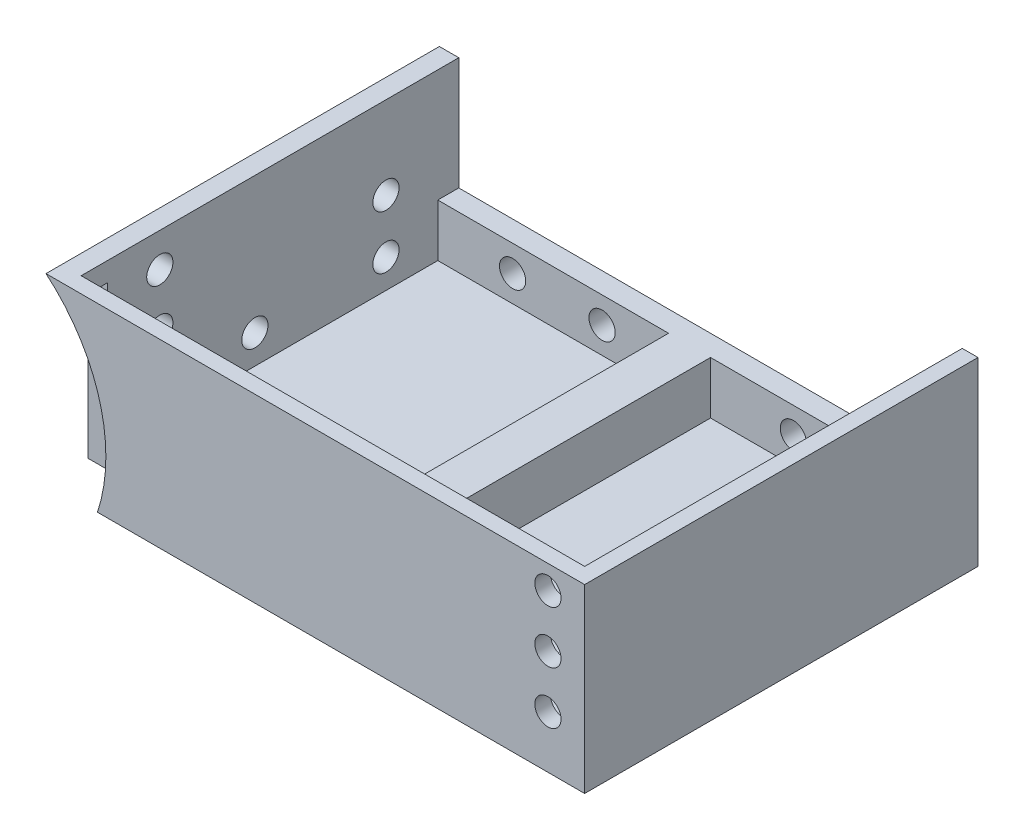
ISO-10303-21;
HEADER;
FILE_DESCRIPTION(('STEP AP214'),'2;1');
FILE_NAME('part.step','',(''),(''),'','','');
FILE_SCHEMA(('AUTOMOTIVE_DESIGN { 1 0 10303 214 1 1 1 1 }'));
ENDSEC;
DATA;
#1=APPLICATION_CONTEXT('core data for automotive mechanical design processes');
#2=APPLICATION_PROTOCOL_DEFINITION('international standard','automotive_design',2000,#1);
#3=PRODUCT_CONTEXT('',#1,'mechanical');
#4=PRODUCT('Part','Part','',(#3));
#5=PRODUCT_RELATED_PRODUCT_CATEGORY('part','',(#4));
#6=PRODUCT_DEFINITION_FORMATION('','',#4);
#7=PRODUCT_DEFINITION_CONTEXT('part definition',#1,'design');
#8=PRODUCT_DEFINITION('design','',#6,#7);
#9=PRODUCT_DEFINITION_SHAPE('','',#8);
#10=(LENGTH_UNIT() NAMED_UNIT(*) SI_UNIT(.MILLI.,.METRE.));
#11=(NAMED_UNIT(*) PLANE_ANGLE_UNIT() SI_UNIT($,.RADIAN.));
#12=(NAMED_UNIT(*) SI_UNIT($,.STERADIAN.) SOLID_ANGLE_UNIT());
#13=UNCERTAINTY_MEASURE_WITH_UNIT(LENGTH_MEASURE(1.E-05),#10,'distance_accuracy_value','');
#14=(GEOMETRIC_REPRESENTATION_CONTEXT(3) GLOBAL_UNCERTAINTY_ASSIGNED_CONTEXT((#13)) GLOBAL_UNIT_ASSIGNED_CONTEXT((#10,
#11,#12)) REPRESENTATION_CONTEXT('',''));
#15=CARTESIAN_POINT('',(0.,0.,0.));
#16=DIRECTION('',(0.,0.,1.));
#17=DIRECTION('',(1.,0.,0.));
#18=AXIS2_PLACEMENT_3D('',#15,#16,#17);
#19=CARTESIAN_POINT('',(37.7894736842105,3.,83.5131578947368));
#20=DIRECTION('',(1.,0.,0.));
#21=DIRECTION('',(0.,0.,-1.));
#22=AXIS2_PLACEMENT_3D('',#19,#20,#21);
#23=PLANE('',#22);
#24=DIRECTION('',(0.,0.,-1.));
#25=VECTOR('',#24,1.);
#26=CARTESIAN_POINT('',(37.7894736842105,34.5,83.5131578947368));
#27=LINE('',#26,#25);
#28=CARTESIAN_POINT('',(37.7894736842105,34.5,83.5131578947368));
#29=VERTEX_POINT('',#28);
#30=CARTESIAN_POINT('',(37.7894736842105,34.5,11.5131578947368));
#31=VERTEX_POINT('',#30);
#32=EDGE_CURVE('E341',#29,#31,#27,.T.);
#33=ORIENTED_EDGE('',*,*,#32,.T.);
#34=DIRECTION('',(0.,-1.,0.));
#35=VECTOR('',#34,1.);
#36=CARTESIAN_POINT('',(37.7894736842105,3.,11.5131578947368));
#37=LINE('',#36,#35);
#38=CARTESIAN_POINT('',(37.7894736842105,13.,11.5131578947368));
#39=VERTEX_POINT('',#38);
#40=EDGE_CURVE('E216',#31,#39,#37,.T.);
#41=ORIENTED_EDGE('',*,*,#40,.T.);
#42=DIRECTION('',(0.,0.,-1.));
#43=VECTOR('',#42,1.);
#44=CARTESIAN_POINT('',(37.7894736842105,13.,15.5131578947368));
#45=LINE('',#44,#43);
#46=CARTESIAN_POINT('',(37.7894736842105,13.,15.5131578947368));
#47=VERTEX_POINT('',#46);
#48=EDGE_CURVE('E259',#47,#39,#45,.T.);
#49=ORIENTED_EDGE('',*,*,#48,.F.);
#50=DIRECTION('',(0.,-1.,0.));
#51=VECTOR('',#50,1.);
#52=CARTESIAN_POINT('',(37.7894736842105,13.,15.5131578947368));
#53=LINE('',#52,#51);
#54=CARTESIAN_POINT('',(37.7894736842105,3.,15.5131578947368));
#55=VERTEX_POINT('',#54);
#56=EDGE_CURVE('E262',#47,#55,#53,.T.);
#57=ORIENTED_EDGE('',*,*,#56,.T.);
#58=DIRECTION('',(0.,0.,-1.));
#59=VECTOR('',#58,1.);
#60=CARTESIAN_POINT('',(37.7894736842105,3.,83.5131578947368));
#61=LINE('',#60,#59);
#62=CARTESIAN_POINT('',(37.7894736842105,3.,83.5131578947368));
#63=VERTEX_POINT('',#62);
#64=EDGE_CURVE('E330',#63,#55,#61,.T.);
#65=ORIENTED_EDGE('',*,*,#64,.F.);
#66=DIRECTION('',(0.,1.,0.));
#67=VECTOR('',#66,1.);
#68=CARTESIAN_POINT('',(37.7894736842105,3.,83.5131578947368));
#69=LINE('',#68,#67);
#70=EDGE_CURVE('E347',#63,#29,#69,.T.);
#71=ORIENTED_EDGE('',*,*,#70,.T.);
#72=EDGE_LOOP('',(#33,#41,#49,#57,#65,#71));
#73=FACE_BOUND('',#72,.T.);
#74=ADVANCED_FACE('F33',(#73),#23,.F.);
#75=CARTESIAN_POINT('',(37.7894736842105,3.,83.5131578947368));
#76=DIRECTION('',(0.,0.,1.));
#77=DIRECTION('',(1.,0.,0.));
#78=AXIS2_PLACEMENT_3D('',#75,#76,#77);
#79=PLANE('',#78);
#80=CARTESIAN_POINT('',(33.7894736842105,10.,83.5131578947368));
#81=DIRECTION('',(0.,0.,1.));
#82=DIRECTION('',(1.,0.,0.));
#83=AXIS2_PLACEMENT_3D('',#80,#81,#82);
#84=CIRCLE('',#83,2.5);
#85=CARTESIAN_POINT('',(36.2894736842105,10.,83.5131578947368));
#86=VERTEX_POINT('',#85);
#87=EDGE_CURVE('E328',#86,#86,#84,.T.);
#88=ORIENTED_EDGE('',*,*,#87,.T.);
#89=EDGE_LOOP('',(#88));
#90=FACE_BOUND('',#89,.T.);
#91=CARTESIAN_POINT('',(33.7894736842105,30.,83.5131578947368));
#92=DIRECTION('',(0.,0.,1.));
#93=DIRECTION('',(1.,0.,0.));
#94=AXIS2_PLACEMENT_3D('',#91,#92,#93);
#95=CIRCLE('',#94,2.5);
#96=CARTESIAN_POINT('',(36.2894736842105,30.,83.5131578947368));
#97=VERTEX_POINT('',#96);
#98=EDGE_CURVE('E322',#97,#97,#95,.T.);
#99=ORIENTED_EDGE('',*,*,#98,.T.);
#100=EDGE_LOOP('',(#99));
#101=FACE_BOUND('',#100,.T.);
#102=CARTESIAN_POINT('',(33.7894736842105,20.,83.5131578947368));
#103=DIRECTION('',(0.,0.,1.));
#104=DIRECTION('',(1.,0.,0.));
#105=AXIS2_PLACEMENT_3D('',#102,#103,#104);
#106=CIRCLE('',#105,2.5);
#107=CARTESIAN_POINT('',(36.2894736842105,20.,83.5131578947368));
#108=VERTEX_POINT('',#107);
#109=EDGE_CURVE('E329',#108,#108,#106,.T.);
#110=ORIENTED_EDGE('',*,*,#109,.T.);
#111=EDGE_LOOP('',(#110));
#112=FACE_BOUND('',#111,.T.);
#113=DIRECTION('',(0.,-1.,0.));
#114=VECTOR('',#113,1.);
#115=CARTESIAN_POINT('',(-14.2105263157895,13.,83.5131578947368));
#116=LINE('',#115,#114);
#117=CARTESIAN_POINT('',(-14.2105263157895,13.,83.5131578947368));
#118=VERTEX_POINT('',#117);
#119=CARTESIAN_POINT('',(-14.2105263157895,3.,83.5131578947368));
#120=VERTEX_POINT('',#119);
#121=EDGE_CURVE('E276',#118,#120,#116,.T.);
#122=ORIENTED_EDGE('',*,*,#121,.T.);
#123=DIRECTION('',(1.,0.,0.));
#124=VECTOR('',#123,1.);
#125=CARTESIAN_POINT('',(37.7894736842105,3.,83.5131578947368));
#126=LINE('',#125,#124);
#127=CARTESIAN_POINT('',(-51.275010008008,3.,83.5131578947368));
#128=VERTEX_POINT('',#127);
#129=EDGE_CURVE('E337',#128,#120,#126,.T.);
#130=ORIENTED_EDGE('',*,*,#129,.F.);
#131=CARTESIAN_POINT('',(-82.5,10.,83.5131578947368));
#132=DIRECTION('',(0.,0.,1.));
#133=DIRECTION('',(1.,0.,0.));
#134=AXIS2_PLACEMENT_3D('',#131,#132,#133);
#135=CIRCLE('',#134,32.);
#136=CARTESIAN_POINT('',(-58.2105263157895,30.8331819015734,83.5131578947368));
#137=VERTEX_POINT('',#136);
#138=EDGE_CURVE('E307',#128,#137,#135,.T.);
#139=ORIENTED_EDGE('',*,*,#138,.T.);
#140=DIRECTION('',(0.,1.,0.));
#141=VECTOR('',#140,1.);
#142=CARTESIAN_POINT('',(-58.2105263157895,3.,83.5131578947368));
#143=LINE('',#142,#141);
#144=CARTESIAN_POINT('',(-58.2105263157895,34.5,83.5131578947368));
#145=VERTEX_POINT('',#144);
#146=EDGE_CURVE('E340',#137,#145,#143,.T.);
#147=ORIENTED_EDGE('',*,*,#146,.T.);
#148=DIRECTION('',(1.,0.,0.));
#149=VECTOR('',#148,1.);
#150=CARTESIAN_POINT('',(37.7894736842105,34.5,83.5131578947368));
#151=LINE('',#150,#149);
#152=EDGE_CURVE('E334',#145,#29,#151,.T.);
#153=ORIENTED_EDGE('',*,*,#152,.T.);
#154=ORIENTED_EDGE('',*,*,#70,.F.);
#155=CARTESIAN_POINT('',(-6.21052631578946,3.,83.5131578947368));
#156=VERTEX_POINT('',#155);
#157=EDGE_CURVE('E336',#156,#63,#126,.T.);
#158=ORIENTED_EDGE('',*,*,#157,.F.);
#159=DIRECTION('',(0.,-1.,0.));
#160=VECTOR('',#159,1.);
#161=CARTESIAN_POINT('',(-6.21052631578946,13.,83.5131578947368));
#162=LINE('',#161,#160);
#163=CARTESIAN_POINT('',(-6.21052631578946,13.,83.5131578947368));
#164=VERTEX_POINT('',#163);
#165=EDGE_CURVE('E274',#164,#156,#162,.T.);
#166=ORIENTED_EDGE('',*,*,#165,.F.);
#167=DIRECTION('',(1.,0.,0.));
#168=VECTOR('',#167,1.);
#169=CARTESIAN_POINT('',(-14.2105263157895,13.,83.5131578947368));
#170=LINE('',#169,#168);
#171=EDGE_CURVE('E253',#118,#164,#170,.T.);
#172=ORIENTED_EDGE('',*,*,#171,.F.);
#173=EDGE_LOOP('',(#122,#130,#139,#147,#153,#154,#158,#166,#172));
#174=FACE_BOUND('',#173,.T.);
#175=ADVANCED_FACE('F395',(#90,#101,#112,#174),#79,.F.);
#176=CARTESIAN_POINT('',(-58.2105263157895,3.,83.5131578947368));
#177=DIRECTION('',(-1.,0.,0.));
#178=DIRECTION('',(0.,0.,1.));
#179=AXIS2_PLACEMENT_3D('',#176,#177,#178);
#180=PLANE('',#179);
#181=CARTESIAN_POINT('',(-58.2105263157895,8.5278716854873,50.3865388429953));
#182=DIRECTION('',(1.,0.,0.));
#183=DIRECTION('',(0.,0.,-1.));
#184=AXIS2_PLACEMENT_3D('',#181,#182,#183);
#185=CIRCLE('',#184,2.5);
#186=CARTESIAN_POINT('',(-58.2105263157895,8.5278716854873,47.8865388429953));
#187=VERTEX_POINT('',#186);
#188=EDGE_CURVE('E228',#187,#187,#185,.T.);
#189=ORIENTED_EDGE('',*,*,#188,.F.);
#190=EDGE_LOOP('',(#189));
#191=FACE_BOUND('',#190,.T.);
#192=CARTESIAN_POINT('',(-58.2105263157895,18.7508611413136,25.4002240224816));
#193=DIRECTION('',(1.,0.,0.));
#194=DIRECTION('',(0.,0.,-1.));
#195=AXIS2_PLACEMENT_3D('',#192,#193,#194);
#196=CIRCLE('',#195,2.5);
#197=CARTESIAN_POINT('',(-58.2105263157895,18.7508611413136,22.9002240224816));
#198=VERTEX_POINT('',#197);
#199=EDGE_CURVE('E224',#198,#198,#196,.T.);
#200=ORIENTED_EDGE('',*,*,#199,.F.);
#201=EDGE_LOOP('',(#200));
#202=FACE_BOUND('',#201,.T.);
#203=CARTESIAN_POINT('',(-58.2105263157895,8.5278716854873,25.4002240224816));
#204=DIRECTION('',(1.,0.,0.));
#205=DIRECTION('',(0.,0.,-1.));
#206=AXIS2_PLACEMENT_3D('',#203,#204,#205);
#207=CIRCLE('',#206,2.5);
#208=CARTESIAN_POINT('',(-58.2105263157895,8.5278716854873,22.9002240224816));
#209=VERTEX_POINT('',#208);
#210=EDGE_CURVE('E227',#209,#209,#207,.T.);
#211=ORIENTED_EDGE('',*,*,#210,.F.);
#212=EDGE_LOOP('',(#211));
#213=FACE_BOUND('',#212,.T.);
#214=CARTESIAN_POINT('',(-58.2105263157895,8.,68.5131578947368));
#215=DIRECTION('',(1.,0.,0.));
#216=DIRECTION('',(0.,0.,-1.));
#217=AXIS2_PLACEMENT_3D('',#214,#215,#216);
#218=CIRCLE('',#217,2.49999999999999);
#219=CARTESIAN_POINT('',(-58.2105263157895,8.,66.0131578947369));
#220=VERTEX_POINT('',#219);
#221=EDGE_CURVE('E288',#220,#220,#218,.T.);
#222=ORIENTED_EDGE('',*,*,#221,.F.);
#223=EDGE_LOOP('',(#222));
#224=FACE_BOUND('',#223,.T.);
#225=CARTESIAN_POINT('',(-58.2105263157895,28.,68.5131578947368));
#226=DIRECTION('',(1.,0.,0.));
#227=DIRECTION('',(0.,0.,-1.));
#228=AXIS2_PLACEMENT_3D('',#225,#226,#227);
#229=CIRCLE('',#228,2.50000000000001);
#230=CARTESIAN_POINT('',(-58.2105263157895,28.,66.0131578947368));
#231=VERTEX_POINT('',#230);
#232=EDGE_CURVE('E284',#231,#231,#229,.T.);
#233=ORIENTED_EDGE('',*,*,#232,.F.);
#234=EDGE_LOOP('',(#233));
#235=FACE_BOUND('',#234,.T.);
#236=CARTESIAN_POINT('',(-58.2105263157895,18.,68.5131578947368));
#237=DIRECTION('',(1.,0.,0.));
#238=DIRECTION('',(0.,0.,-1.));
#239=AXIS2_PLACEMENT_3D('',#236,#237,#238);
#240=CIRCLE('',#239,2.50000000000001);
#241=CARTESIAN_POINT('',(-58.2105263157895,18.,66.0131578947368));
#242=VERTEX_POINT('',#241);
#243=EDGE_CURVE('E285',#242,#242,#240,.T.);
#244=ORIENTED_EDGE('',*,*,#243,.F.);
#245=EDGE_LOOP('',(#244));
#246=FACE_BOUND('',#245,.T.);
#247=DIRECTION('',(0.,0.,1.));
#248=VECTOR('',#247,1.);
#249=CARTESIAN_POINT('',(-58.2105263157895,13.,15.5131578947368));
#250=LINE('',#249,#248);
#251=CARTESIAN_POINT('',(-58.2105263157895,13.,11.5131578947368));
#252=VERTEX_POINT('',#251);
#253=CARTESIAN_POINT('',(-58.2105263157895,13.,15.5131578947368));
#254=VERTEX_POINT('',#253);
#255=EDGE_CURVE('E246',#252,#254,#250,.T.);
#256=ORIENTED_EDGE('',*,*,#255,.F.);
#257=DIRECTION('',(0.,1.,0.));
#258=VECTOR('',#257,1.);
#259=CARTESIAN_POINT('',(-58.2105263157895,3.,11.5131578947368));
#260=LINE('',#259,#258);
#261=CARTESIAN_POINT('',(-58.2105263157895,34.5,11.5131578947368));
#262=VERTEX_POINT('',#261);
#263=EDGE_CURVE('E50',#252,#262,#260,.T.);
#264=ORIENTED_EDGE('',*,*,#263,.T.);
#265=DIRECTION('',(0.,0.,1.));
#266=VECTOR('',#265,1.);
#267=CARTESIAN_POINT('',(-58.2105263157895,34.5,83.5131578947368));
#268=LINE('',#267,#266);
#269=EDGE_CURVE('E180',#262,#145,#268,.T.);
#270=ORIENTED_EDGE('',*,*,#269,.T.);
#271=ORIENTED_EDGE('',*,*,#146,.F.);
#272=DIRECTION('',(0.,0.,1.));
#273=VECTOR('',#272,1.);
#274=CARTESIAN_POINT('',(-58.2105263157895,30.8331819015734,78.5131578947368));
#275=LINE('',#274,#273);
#276=CARTESIAN_POINT('',(-58.2105263157895,30.8331819015734,78.5131578947368));
#277=VERTEX_POINT('',#276);
#278=EDGE_CURVE('E310',#137,#277,#275,.F.);
#279=ORIENTED_EDGE('',*,*,#278,.T.);
#280=DIRECTION('',(0.,1.,0.));
#281=VECTOR('',#280,1.);
#282=CARTESIAN_POINT('',(-58.2105263157895,3.,78.5131578947368));
#283=LINE('',#282,#281);
#284=CARTESIAN_POINT('',(-58.2105263157895,3.,78.5131578947368));
#285=VERTEX_POINT('',#284);
#286=EDGE_CURVE('E303',#285,#277,#283,.T.);
#287=ORIENTED_EDGE('',*,*,#286,.F.);
#288=DIRECTION('',(0.,0.,1.));
#289=VECTOR('',#288,1.);
#290=CARTESIAN_POINT('',(-58.2105263157895,3.,83.5131578947368));
#291=LINE('',#290,#289);
#292=CARTESIAN_POINT('',(-58.2105263157895,3.,15.5131578947368));
#293=VERTEX_POINT('',#292);
#294=EDGE_CURVE('E333',#293,#285,#291,.T.);
#295=ORIENTED_EDGE('',*,*,#294,.F.);
#296=DIRECTION('',(0.,-1.,0.));
#297=VECTOR('',#296,1.);
#298=CARTESIAN_POINT('',(-58.2105263157895,13.,15.5131578947368));
#299=LINE('',#298,#297);
#300=EDGE_CURVE('E282',#254,#293,#299,.T.);
#301=ORIENTED_EDGE('',*,*,#300,.F.);
#302=EDGE_LOOP('',(#256,#264,#270,#271,#279,#287,#295,#301));
#303=FACE_BOUND('',#302,.T.);
#304=ADVANCED_FACE('F391',(#191,#202,#213,#224,#235,#246,#303),#180,.F.);
#305=CARTESIAN_POINT('',(0.,3.,0.));
#306=DIRECTION('',(0.,1.,0.));
#307=DIRECTION('',(0.,0.,1.));
#308=AXIS2_PLACEMENT_3D('',#305,#306,#307);
#309=PLANE('',#308);
#310=DIRECTION('',(0.,0.,1.));
#311=VECTOR('',#310,1.);
#312=CARTESIAN_POINT('',(-14.2105263157895,3.,15.5131578947368));
#313=LINE('',#312,#311);
#314=CARTESIAN_POINT('',(-14.2105263157895,3.,15.5131578947368));
#315=VERTEX_POINT('',#314);
#316=EDGE_CURVE('E264',#315,#120,#313,.T.);
#317=ORIENTED_EDGE('',*,*,#316,.F.);
#318=DIRECTION('',(1.,0.,0.));
#319=VECTOR('',#318,1.);
#320=CARTESIAN_POINT('',(-58.2105263157895,3.,15.5131578947368));
#321=LINE('',#320,#319);
#322=EDGE_CURVE('E245',#293,#315,#321,.T.);
#323=ORIENTED_EDGE('',*,*,#322,.F.);
#324=ORIENTED_EDGE('',*,*,#294,.T.);
#325=DIRECTION('',(1.,0.,0.));
#326=VECTOR('',#325,1.);
#327=CARTESIAN_POINT('',(0.,3.,78.5131578947368));
#328=LINE('',#327,#326);
#329=CARTESIAN_POINT('',(-51.275010008008,3.,78.5131578947368));
#330=VERTEX_POINT('',#329);
#331=EDGE_CURVE('E300',#285,#330,#328,.T.);
#332=ORIENTED_EDGE('',*,*,#331,.T.);
#333=DIRECTION('',(0.,0.,1.));
#334=VECTOR('',#333,1.);
#335=CARTESIAN_POINT('',(-51.275010008008,3.,78.5131578947368));
#336=LINE('',#335,#334);
#337=EDGE_CURVE('E305',#128,#330,#336,.F.);
#338=ORIENTED_EDGE('',*,*,#337,.F.);
#339=ORIENTED_EDGE('',*,*,#129,.T.);
#340=EDGE_LOOP('',(#317,#323,#324,#332,#338,#339));
#341=FACE_BOUND('',#340,.T.);
#342=ADVANCED_FACE('F394',(#341),#309,.T.);
#343=CARTESIAN_POINT('',(19.7894736842105,3.,43.5131578947368));
#344=DIRECTION('',(0.,1.,0.));
#345=DIRECTION('',(0.,0.,1.));
#346=AXIS2_PLACEMENT_3D('',#343,#344,#345);
#347=CIRCLE('',#346,2.5);
#348=CARTESIAN_POINT('',(19.7894736842105,3.,46.0131578947368));
#349=VERTEX_POINT('',#348);
#350=EDGE_CURVE('E220',#349,#349,#347,.T.);
#351=ORIENTED_EDGE('',*,*,#350,.F.);
#352=EDGE_LOOP('',(#351));
#353=FACE_BOUND('',#352,.T.);
#354=DIRECTION('',(1.,0.,0.));
#355=VECTOR('',#354,1.);
#356=CARTESIAN_POINT('',(-6.21052631578946,3.,15.5131578947368));
#357=LINE('',#356,#355);
#358=CARTESIAN_POINT('',(-6.21052631578946,3.,15.5131578947368));
#359=VERTEX_POINT('',#358);
#360=EDGE_CURVE('E249',#359,#55,#357,.T.);
#361=ORIENTED_EDGE('',*,*,#360,.F.);
#362=DIRECTION('',(0.,0.,-1.));
#363=VECTOR('',#362,1.);
#364=CARTESIAN_POINT('',(-6.21052631578946,3.,15.5131578947368));
#365=LINE('',#364,#363);
#366=EDGE_CURVE('E266',#156,#359,#365,.T.);
#367=ORIENTED_EDGE('',*,*,#366,.F.);
#368=ORIENTED_EDGE('',*,*,#157,.T.);
#369=ORIENTED_EDGE('',*,*,#64,.T.);
#370=EDGE_LOOP('',(#361,#367,#368,#369));
#371=FACE_BOUND('',#370,.T.);
#372=ADVANCED_FACE('F431',(#353,#371),#309,.T.);
#373=CARTESIAN_POINT('',(0.,0.,0.));
#374=DIRECTION('',(0.,1.,0.));
#375=DIRECTION('',(0.,0.,1.));
#376=AXIS2_PLACEMENT_3D('',#373,#374,#375);
#377=PLANE('',#376);
#378=CARTESIAN_POINT('',(19.7894736842105,0.,43.5131578947368));
#379=DIRECTION('',(0.,1.,0.));
#380=DIRECTION('',(0.,0.,1.));
#381=AXIS2_PLACEMENT_3D('',#378,#379,#380);
#382=CIRCLE('',#381,2.5);
#383=CARTESIAN_POINT('',(19.7894736842105,0.,46.0131578947368));
#384=VERTEX_POINT('',#383);
#385=EDGE_CURVE('E223',#384,#384,#382,.T.);
#386=ORIENTED_EDGE('',*,*,#385,.T.);
#387=EDGE_LOOP('',(#386));
#388=FACE_BOUND('',#387,.T.);
#389=DIRECTION('',(1.,0.,0.));
#390=VECTOR('',#389,1.);
#391=CARTESIAN_POINT('',(0.,0.,78.5131578947368));
#392=LINE('',#391,#390);
#393=CARTESIAN_POINT('',(-61.9148111497611,0.,78.5131578947368));
#394=VERTEX_POINT('',#393);
#395=CARTESIAN_POINT('',(-52.1026316928587,0.,78.5131578947368));
#396=VERTEX_POINT('',#395);
#397=EDGE_CURVE('E297',#394,#396,#392,.T.);
#398=ORIENTED_EDGE('',*,*,#397,.F.);
#399=DIRECTION('',(0.,0.,-1.));
#400=VECTOR('',#399,1.);
#401=CARTESIAN_POINT('',(-61.9148111497611,0.,0.));
#402=LINE('',#401,#400);
#403=CARTESIAN_POINT('',(-61.9148111497611,0.,11.5131578947368));
#404=VERTEX_POINT('',#403);
#405=EDGE_CURVE('E202',#394,#404,#402,.T.);
#406=ORIENTED_EDGE('',*,*,#405,.T.);
#407=DIRECTION('',(1.,0.,0.));
#408=VECTOR('',#407,1.);
#409=CARTESIAN_POINT('',(0.,0.,11.5131578947368));
#410=LINE('',#409,#408);
#411=CARTESIAN_POINT('',(40.7894736842105,0.,11.5131578947368));
#412=VERTEX_POINT('',#411);
#413=EDGE_CURVE('E162',#404,#412,#410,.T.);
#414=ORIENTED_EDGE('',*,*,#413,.T.);
#415=DIRECTION('',(0.,0.,-1.));
#416=VECTOR('',#415,1.);
#417=CARTESIAN_POINT('',(40.7894736842105,0.,-63.4868421052632));
#418=LINE('',#417,#416);
#419=CARTESIAN_POINT('',(40.7894736842105,0.,86.5131578947368));
#420=VERTEX_POINT('',#419);
#421=EDGE_CURVE('E354',#420,#412,#418,.T.);
#422=ORIENTED_EDGE('',*,*,#421,.F.);
#423=DIRECTION('',(1.,0.,0.));
#424=VECTOR('',#423,1.);
#425=CARTESIAN_POINT('',(-109.21052631579,0.,86.5131578947368));
#426=LINE('',#425,#424);
#427=CARTESIAN_POINT('',(-52.1026316928587,0.,86.5131578947368));
#428=VERTEX_POINT('',#427);
#429=EDGE_CURVE('E349',#428,#420,#426,.T.);
#430=ORIENTED_EDGE('',*,*,#429,.F.);
#431=DIRECTION('',(0.,0.,1.));
#432=VECTOR('',#431,1.);
#433=CARTESIAN_POINT('',(-52.1026316928587,0.,78.5131578947368));
#434=LINE('',#433,#432);
#435=EDGE_CURVE('E313',#428,#396,#434,.F.);
#436=ORIENTED_EDGE('',*,*,#435,.T.);
#437=EDGE_LOOP('',(#398,#406,#414,#422,#430,#436));
#438=FACE_BOUND('',#437,.T.);
#439=ADVANCED_FACE('F447',(#388,#438),#377,.F.);
#440=CARTESIAN_POINT('',(-109.21052631579,34.5,86.5131578947368));
#441=DIRECTION('',(0.,0.,-1.));
#442=DIRECTION('',(-1.,0.,0.));
#443=AXIS2_PLACEMENT_3D('',#440,#441,#442);
#444=PLANE('',#443);
#445=CARTESIAN_POINT('',(33.7894736842105,10.,86.5131578947368));
#446=DIRECTION('',(0.,0.,1.));
#447=DIRECTION('',(1.,0.,0.));
#448=AXIS2_PLACEMENT_3D('',#445,#446,#447);
#449=CIRCLE('',#448,2.5);
#450=CARTESIAN_POINT('',(36.2894736842105,10.,86.5131578947368));
#451=VERTEX_POINT('',#450);
#452=EDGE_CURVE('E325',#451,#451,#449,.T.);
#453=ORIENTED_EDGE('',*,*,#452,.F.);
#454=EDGE_LOOP('',(#453));
#455=FACE_BOUND('',#454,.T.);
#456=CARTESIAN_POINT('',(33.7894736842105,30.,86.5131578947368));
#457=DIRECTION('',(0.,0.,1.));
#458=DIRECTION('',(1.,0.,0.));
#459=AXIS2_PLACEMENT_3D('',#456,#457,#458);
#460=CIRCLE('',#459,2.5);
#461=CARTESIAN_POINT('',(36.2894736842105,30.,86.5131578947368));
#462=VERTEX_POINT('',#461);
#463=EDGE_CURVE('E318',#462,#462,#460,.T.);
#464=ORIENTED_EDGE('',*,*,#463,.F.);
#465=EDGE_LOOP('',(#464));
#466=FACE_BOUND('',#465,.T.);
#467=CARTESIAN_POINT('',(33.7894736842105,20.,86.5131578947368));
#468=DIRECTION('',(0.,0.,1.));
#469=DIRECTION('',(1.,0.,0.));
#470=AXIS2_PLACEMENT_3D('',#467,#468,#469);
#471=CIRCLE('',#470,2.5);
#472=CARTESIAN_POINT('',(36.2894736842105,20.,86.5131578947368));
#473=VERTEX_POINT('',#472);
#474=EDGE_CURVE('E319',#473,#473,#471,.T.);
#475=ORIENTED_EDGE('',*,*,#474,.F.);
#476=EDGE_LOOP('',(#475));
#477=FACE_BOUND('',#476,.T.);
#478=DIRECTION('',(1.,0.,0.));
#479=VECTOR('',#478,1.);
#480=CARTESIAN_POINT('',(-109.21052631579,34.5,86.5131578947368));
#481=LINE('',#480,#479);
#482=CARTESIAN_POINT('',(-61.9148111497611,34.5,86.5131578947368));
#483=VERTEX_POINT('',#482);
#484=CARTESIAN_POINT('',(40.7894736842105,34.5,86.5131578947368));
#485=VERTEX_POINT('',#484);
#486=EDGE_CURVE('E352',#483,#485,#481,.T.);
#487=ORIENTED_EDGE('',*,*,#486,.F.);
#488=CARTESIAN_POINT('',(-82.5,10.,86.5131578947368));
#489=DIRECTION('',(0.,0.,1.));
#490=DIRECTION('',(1.,0.,0.));
#491=AXIS2_PLACEMENT_3D('',#488,#489,#490);
#492=CIRCLE('',#491,32.);
#493=EDGE_CURVE('E293',#428,#483,#492,.T.);
#494=ORIENTED_EDGE('',*,*,#493,.F.);
#495=ORIENTED_EDGE('',*,*,#429,.T.);
#496=DIRECTION('',(0.,-1.,0.));
#497=VECTOR('',#496,1.);
#498=CARTESIAN_POINT('',(40.7894736842105,34.5,86.5131578947368));
#499=LINE('',#498,#497);
#500=EDGE_CURVE('E11',#485,#420,#499,.T.);
#501=ORIENTED_EDGE('',*,*,#500,.F.);
#502=EDGE_LOOP('',(#487,#494,#495,#501));
#503=FACE_BOUND('',#502,.T.);
#504=ADVANCED_FACE('F35',(#455,#466,#477,#503),#444,.F.);
#505=CARTESIAN_POINT('',(40.7894736842105,34.5,-63.4868421052632));
#506=DIRECTION('',(-1.,0.,0.));
#507=DIRECTION('',(0.,0.,1.));
#508=AXIS2_PLACEMENT_3D('',#505,#506,#507);
#509=PLANE('',#508);
#510=ORIENTED_EDGE('',*,*,#421,.T.);
#511=DIRECTION('',(0.,1.,0.));
#512=VECTOR('',#511,1.);
#513=CARTESIAN_POINT('',(40.7894736842105,-5.5,11.5131578947368));
#514=LINE('',#513,#512);
#515=CARTESIAN_POINT('',(40.7894736842105,34.5,11.5131578947368));
#516=VERTEX_POINT('',#515);
#517=EDGE_CURVE('E165',#412,#516,#514,.T.);
#518=ORIENTED_EDGE('',*,*,#517,.T.);
#519=DIRECTION('',(0.,0.,-1.));
#520=VECTOR('',#519,1.);
#521=CARTESIAN_POINT('',(40.7894736842105,34.5,-63.4868421052632));
#522=LINE('',#521,#520);
#523=EDGE_CURVE('E42',#485,#516,#522,.T.);
#524=ORIENTED_EDGE('',*,*,#523,.F.);
#525=ORIENTED_EDGE('',*,*,#500,.T.);
#526=EDGE_LOOP('',(#510,#518,#524,#525));
#527=FACE_BOUND('',#526,.T.);
#528=ADVANCED_FACE('F443',(#527),#509,.F.);
#529=CARTESIAN_POINT('',(0.,34.5,0.));
#530=DIRECTION('',(0.,1.,0.));
#531=DIRECTION('',(0.,0.,1.));
#532=AXIS2_PLACEMENT_3D('',#529,#530,#531);
#533=PLANE('',#532);
#534=DIRECTION('',(0.,0.,-1.));
#535=VECTOR('',#534,1.);
#536=CARTESIAN_POINT('',(-61.9148111497611,34.5,86.5131578947368));
#537=LINE('',#536,#535);
#538=CARTESIAN_POINT('',(-61.9148111497611,34.5,78.5131578947368));
#539=VERTEX_POINT('',#538);
#540=CARTESIAN_POINT('',(-61.9148111497611,34.5,11.5131578947368));
#541=VERTEX_POINT('',#540);
#542=EDGE_CURVE('E168',#539,#541,#537,.T.);
#543=ORIENTED_EDGE('',*,*,#542,.F.);
#544=DIRECTION('',(0.,0.,1.));
#545=VECTOR('',#544,1.);
#546=CARTESIAN_POINT('',(-61.9148111497611,34.5,78.5131578947368));
#547=LINE('',#546,#545);
#548=EDGE_CURVE('E316',#483,#539,#547,.F.);
#549=ORIENTED_EDGE('',*,*,#548,.F.);
#550=ORIENTED_EDGE('',*,*,#486,.T.);
#551=ORIENTED_EDGE('',*,*,#523,.T.);
#552=DIRECTION('',(1.,0.,0.));
#553=VECTOR('',#552,1.);
#554=CARTESIAN_POINT('',(-61.9148111497611,34.5,11.5131578947368));
#555=LINE('',#554,#553);
#556=EDGE_CURVE('E175',#31,#516,#555,.T.);
#557=ORIENTED_EDGE('',*,*,#556,.F.);
#558=ORIENTED_EDGE('',*,*,#32,.F.);
#559=ORIENTED_EDGE('',*,*,#152,.F.);
#560=ORIENTED_EDGE('',*,*,#269,.F.);
#561=EDGE_CURVE('E160',#541,#262,#555,.T.);
#562=ORIENTED_EDGE('',*,*,#561,.F.);
#563=EDGE_LOOP('',(#543,#549,#550,#551,#557,#558,#559,#560,#562));
#564=FACE_BOUND('',#563,.T.);
#565=ADVANCED_FACE('F178',(#564),#533,.T.);
#566=CARTESIAN_POINT('',(33.7894736842105,10.,81.5131578947368));
#567=DIRECTION('',(0.,0.,1.));
#568=DIRECTION('',(1.,0.,0.));
#569=AXIS2_PLACEMENT_3D('',#566,#567,#568);
#570=CYLINDRICAL_SURFACE('',#569,2.5);
#571=ORIENTED_EDGE('',*,*,#452,.T.);
#572=EDGE_LOOP('',(#571));
#573=FACE_BOUND('',#572,.T.);
#574=ORIENTED_EDGE('',*,*,#87,.F.);
#575=EDGE_LOOP('',(#574));
#576=FACE_BOUND('',#575,.T.);
#577=ADVANCED_FACE('F476',(#573,#576),#570,.F.);
#578=CARTESIAN_POINT('',(33.7894736842105,30.,81.5131578947368));
#579=DIRECTION('',(0.,0.,1.));
#580=DIRECTION('',(1.,0.,0.));
#581=AXIS2_PLACEMENT_3D('',#578,#579,#580);
#582=CYLINDRICAL_SURFACE('',#581,2.5);
#583=ORIENTED_EDGE('',*,*,#463,.T.);
#584=EDGE_LOOP('',(#583));
#585=FACE_BOUND('',#584,.T.);
#586=ORIENTED_EDGE('',*,*,#98,.F.);
#587=EDGE_LOOP('',(#586));
#588=FACE_BOUND('',#587,.T.);
#589=ADVANCED_FACE('F499',(#585,#588),#582,.F.);
#590=CARTESIAN_POINT('',(33.7894736842105,20.,81.5131578947368));
#591=DIRECTION('',(0.,0.,1.));
#592=DIRECTION('',(1.,0.,0.));
#593=AXIS2_PLACEMENT_3D('',#590,#591,#592);
#594=CYLINDRICAL_SURFACE('',#593,2.5);
#595=ORIENTED_EDGE('',*,*,#474,.T.);
#596=EDGE_LOOP('',(#595));
#597=FACE_BOUND('',#596,.T.);
#598=ORIENTED_EDGE('',*,*,#109,.F.);
#599=EDGE_LOOP('',(#598));
#600=FACE_BOUND('',#599,.T.);
#601=ADVANCED_FACE('F496',(#597,#600),#594,.F.);
#602=CARTESIAN_POINT('',(-82.5,10.,78.5131578947368));
#603=DIRECTION('',(0.,0.,1.));
#604=DIRECTION('',(1.,0.,0.));
#605=AXIS2_PLACEMENT_3D('',#602,#603,#604);
#606=CYLINDRICAL_SURFACE('',#605,32.);
#607=ORIENTED_EDGE('',*,*,#548,.T.);
#608=CARTESIAN_POINT('',(-82.5,10.,78.5131578947368));
#609=DIRECTION('',(0.,0.,1.));
#610=DIRECTION('',(1.,0.,0.));
#611=AXIS2_PLACEMENT_3D('',#608,#609,#610);
#612=CIRCLE('',#611,32.);
#613=EDGE_CURVE('E294',#277,#539,#612,.T.);
#614=ORIENTED_EDGE('',*,*,#613,.F.);
#615=ORIENTED_EDGE('',*,*,#278,.F.);
#616=ORIENTED_EDGE('',*,*,#138,.F.);
#617=ORIENTED_EDGE('',*,*,#337,.T.);
#618=EDGE_CURVE('E58',#396,#330,#612,.T.);
#619=ORIENTED_EDGE('',*,*,#618,.F.);
#620=ORIENTED_EDGE('',*,*,#435,.F.);
#621=ORIENTED_EDGE('',*,*,#493,.T.);
#622=EDGE_LOOP('',(#607,#614,#615,#616,#617,#619,#620,#621));
#623=FACE_BOUND('',#622,.T.);
#624=ADVANCED_FACE('F452',(#623),#606,.F.);
#625=CARTESIAN_POINT('',(-82.5,10.,78.5131578947368));
#626=DIRECTION('',(0.,0.,1.));
#627=DIRECTION('',(1.,0.,0.));
#628=AXIS2_PLACEMENT_3D('',#625,#626,#627);
#629=PLANE('',#628);
#630=DIRECTION('',(0.,1.,0.));
#631=VECTOR('',#630,1.);
#632=CARTESIAN_POINT('',(-61.9148111497611,10.,78.5131578947368));
#633=LINE('',#632,#631);
#634=EDGE_CURVE('E171',#394,#539,#633,.T.);
#635=ORIENTED_EDGE('',*,*,#634,.F.);
#636=ORIENTED_EDGE('',*,*,#397,.T.);
#637=ORIENTED_EDGE('',*,*,#618,.T.);
#638=ORIENTED_EDGE('',*,*,#331,.F.);
#639=ORIENTED_EDGE('',*,*,#286,.T.);
#640=ORIENTED_EDGE('',*,*,#613,.T.);
#641=EDGE_LOOP('',(#635,#636,#637,#638,#639,#640));
#642=FACE_BOUND('',#641,.T.);
#643=ADVANCED_FACE('F387',(#642),#629,.T.);
#644=CARTESIAN_POINT('',(-68.2105263157895,8.,68.5131578947368));
#645=DIRECTION('',(1.,0.,0.));
#646=DIRECTION('',(0.,0.,-1.));
#647=AXIS2_PLACEMENT_3D('',#644,#645,#646);
#648=CYLINDRICAL_SURFACE('',#647,2.49999999999999);
#649=CARTESIAN_POINT('',(-61.9148111497611,8.,68.5131578947368));
#650=DIRECTION('',(1.,0.,0.));
#651=DIRECTION('',(0.,0.,-1.));
#652=AXIS2_PLACEMENT_3D('',#649,#650,#651);
#653=CIRCLE('',#652,2.49999999999999);
#654=CARTESIAN_POINT('',(-61.9148111497611,8.,66.0131578947369));
#655=VERTEX_POINT('',#654);
#656=EDGE_CURVE('E198',#655,#655,#653,.F.);
#657=ORIENTED_EDGE('',*,*,#656,.T.);
#658=EDGE_LOOP('',(#657));
#659=FACE_BOUND('',#658,.T.);
#660=ORIENTED_EDGE('',*,*,#221,.T.);
#661=EDGE_LOOP('',(#660));
#662=FACE_BOUND('',#661,.T.);
#663=ADVANCED_FACE('F383',(#659,#662),#648,.F.);
#664=CARTESIAN_POINT('',(-68.2105263157895,28.,68.5131578947368));
#665=DIRECTION('',(1.,0.,0.));
#666=DIRECTION('',(0.,0.,-1.));
#667=AXIS2_PLACEMENT_3D('',#664,#665,#666);
#668=CYLINDRICAL_SURFACE('',#667,2.50000000000001);
#669=CARTESIAN_POINT('',(-61.9148111497611,28.,68.5131578947368));
#670=DIRECTION('',(1.,0.,0.));
#671=DIRECTION('',(0.,0.,-1.));
#672=AXIS2_PLACEMENT_3D('',#669,#670,#671);
#673=CIRCLE('',#672,2.50000000000001);
#674=CARTESIAN_POINT('',(-61.9148111497611,28.,66.0131578947368));
#675=VERTEX_POINT('',#674);
#676=EDGE_CURVE('E195',#675,#675,#673,.F.);
#677=ORIENTED_EDGE('',*,*,#676,.T.);
#678=EDGE_LOOP('',(#677));
#679=FACE_BOUND('',#678,.T.);
#680=ORIENTED_EDGE('',*,*,#232,.T.);
#681=EDGE_LOOP('',(#680));
#682=FACE_BOUND('',#681,.T.);
#683=ADVANCED_FACE('F386',(#679,#682),#668,.F.);
#684=CARTESIAN_POINT('',(-68.2105263157895,18.,68.5131578947368));
#685=DIRECTION('',(1.,0.,0.));
#686=DIRECTION('',(0.,0.,-1.));
#687=AXIS2_PLACEMENT_3D('',#684,#685,#686);
#688=CYLINDRICAL_SURFACE('',#687,2.50000000000001);
#689=CARTESIAN_POINT('',(-61.9148111497611,18.,68.5131578947368));
#690=DIRECTION('',(1.,0.,0.));
#691=DIRECTION('',(0.,0.,-1.));
#692=AXIS2_PLACEMENT_3D('',#689,#690,#691);
#693=CIRCLE('',#692,2.50000000000001);
#694=CARTESIAN_POINT('',(-61.9148111497611,18.,66.0131578947368));
#695=VERTEX_POINT('',#694);
#696=EDGE_CURVE('E192',#695,#695,#693,.F.);
#697=ORIENTED_EDGE('',*,*,#696,.T.);
#698=EDGE_LOOP('',(#697));
#699=FACE_BOUND('',#698,.T.);
#700=ORIENTED_EDGE('',*,*,#243,.T.);
#701=EDGE_LOOP('',(#700));
#702=FACE_BOUND('',#701,.T.);
#703=ADVANCED_FACE('F566',(#699,#702),#688,.F.);
#704=CARTESIAN_POINT('',(-58.2105263157895,13.,15.5131578947368));
#705=DIRECTION('',(0.,0.,-1.));
#706=DIRECTION('',(-1.,0.,0.));
#707=AXIS2_PLACEMENT_3D('',#704,#705,#706);
#708=PLANE('',#707);
#709=CARTESIAN_POINT('',(-26.8895875202073,8.,15.5131578947368));
#710=DIRECTION('',(0.,0.,1.));
#711=DIRECTION('',(1.,0.,0.));
#712=AXIS2_PLACEMENT_3D('',#709,#710,#711);
#713=CIRCLE('',#712,2.5);
#714=CARTESIAN_POINT('',(-24.3895875202073,8.,15.5131578947368));
#715=VERTEX_POINT('',#714);
#716=EDGE_CURVE('E234',#715,#715,#713,.T.);
#717=ORIENTED_EDGE('',*,*,#716,.F.);
#718=EDGE_LOOP('',(#717));
#719=FACE_BOUND('',#718,.T.);
#720=CARTESIAN_POINT('',(-43.9428822564945,8.,15.5131578947368));
#721=DIRECTION('',(0.,0.,1.));
#722=DIRECTION('',(1.,0.,0.));
#723=AXIS2_PLACEMENT_3D('',#720,#721,#722);
#724=CIRCLE('',#723,2.5);
#725=CARTESIAN_POINT('',(-41.4428822564944,8.,15.5131578947368));
#726=VERTEX_POINT('',#725);
#727=EDGE_CURVE('E237',#726,#726,#724,.T.);
#728=ORIENTED_EDGE('',*,*,#727,.F.);
#729=EDGE_LOOP('',(#728));
#730=FACE_BOUND('',#729,.T.);
#731=ORIENTED_EDGE('',*,*,#322,.T.);
#732=DIRECTION('',(0.,-1.,0.));
#733=VECTOR('',#732,1.);
#734=CARTESIAN_POINT('',(-14.2105263157895,13.,15.5131578947368));
#735=LINE('',#734,#733);
#736=CARTESIAN_POINT('',(-14.2105263157895,13.,15.5131578947368));
#737=VERTEX_POINT('',#736);
#738=EDGE_CURVE('E279',#737,#315,#735,.T.);
#739=ORIENTED_EDGE('',*,*,#738,.F.);
#740=DIRECTION('',(1.,0.,0.));
#741=VECTOR('',#740,1.);
#742=CARTESIAN_POINT('',(-58.2105263157895,13.,15.5131578947368));
#743=LINE('',#742,#741);
#744=EDGE_CURVE('E248',#254,#737,#743,.T.);
#745=ORIENTED_EDGE('',*,*,#744,.F.);
#746=ORIENTED_EDGE('',*,*,#300,.T.);
#747=EDGE_LOOP('',(#731,#739,#745,#746));
#748=FACE_BOUND('',#747,.T.);
#749=ADVANCED_FACE('F410',(#719,#730,#748),#708,.F.);
#750=CARTESIAN_POINT('',(-14.2105263157895,13.,15.5131578947368));
#751=DIRECTION('',(1.,0.,0.));
#752=DIRECTION('',(0.,0.,-1.));
#753=AXIS2_PLACEMENT_3D('',#750,#751,#752);
#754=PLANE('',#753);
#755=ORIENTED_EDGE('',*,*,#316,.T.);
#756=ORIENTED_EDGE('',*,*,#121,.F.);
#757=DIRECTION('',(0.,0.,1.));
#758=VECTOR('',#757,1.);
#759=CARTESIAN_POINT('',(-14.2105263157895,13.,15.5131578947368));
#760=LINE('',#759,#758);
#761=EDGE_CURVE('E251',#737,#118,#760,.T.);
#762=ORIENTED_EDGE('',*,*,#761,.F.);
#763=ORIENTED_EDGE('',*,*,#738,.T.);
#764=EDGE_LOOP('',(#755,#756,#762,#763));
#765=FACE_BOUND('',#764,.T.);
#766=ADVANCED_FACE('F416',(#765),#754,.F.);
#767=CARTESIAN_POINT('',(-6.21052631578946,13.,15.5131578947368));
#768=DIRECTION('',(-1.,0.,0.));
#769=DIRECTION('',(0.,0.,1.));
#770=AXIS2_PLACEMENT_3D('',#767,#768,#769);
#771=PLANE('',#770);
#772=ORIENTED_EDGE('',*,*,#366,.T.);
#773=DIRECTION('',(0.,-1.,0.));
#774=VECTOR('',#773,1.);
#775=CARTESIAN_POINT('',(-6.21052631578946,13.,15.5131578947368));
#776=LINE('',#775,#774);
#777=CARTESIAN_POINT('',(-6.21052631578946,13.,15.5131578947368));
#778=VERTEX_POINT('',#777);
#779=EDGE_CURVE('E271',#778,#359,#776,.T.);
#780=ORIENTED_EDGE('',*,*,#779,.F.);
#781=DIRECTION('',(0.,0.,-1.));
#782=VECTOR('',#781,1.);
#783=CARTESIAN_POINT('',(-6.21052631578946,13.,15.5131578947368));
#784=LINE('',#783,#782);
#785=EDGE_CURVE('E255',#164,#778,#784,.T.);
#786=ORIENTED_EDGE('',*,*,#785,.F.);
#787=ORIENTED_EDGE('',*,*,#165,.T.);
#788=EDGE_LOOP('',(#772,#780,#786,#787));
#789=FACE_BOUND('',#788,.T.);
#790=ADVANCED_FACE('F423',(#789),#771,.F.);
#791=CARTESIAN_POINT('',(-6.21052631578946,13.,15.5131578947368));
#792=DIRECTION('',(0.,0.,-1.));
#793=DIRECTION('',(-1.,0.,0.));
#794=AXIS2_PLACEMENT_3D('',#791,#792,#793);
#795=PLANE('',#794);
#796=CARTESIAN_POINT('',(9.58846659536761,8.,15.5131578947368));
#797=DIRECTION('',(0.,0.,1.));
#798=DIRECTION('',(1.,0.,0.));
#799=AXIS2_PLACEMENT_3D('',#796,#797,#798);
#800=CIRCLE('',#799,2.5);
#801=CARTESIAN_POINT('',(12.0884665953676,8.,15.5131578947368));
#802=VERTEX_POINT('',#801);
#803=EDGE_CURVE('E238',#802,#802,#800,.T.);
#804=ORIENTED_EDGE('',*,*,#803,.F.);
#805=EDGE_LOOP('',(#804));
#806=FACE_BOUND('',#805,.T.);
#807=CARTESIAN_POINT('',(23.5623851101607,8.,15.5131578947368));
#808=DIRECTION('',(0.,0.,1.));
#809=DIRECTION('',(1.,0.,0.));
#810=AXIS2_PLACEMENT_3D('',#807,#808,#809);
#811=CIRCLE('',#810,2.5);
#812=CARTESIAN_POINT('',(26.0623851101607,8.,15.5131578947368));
#813=VERTEX_POINT('',#812);
#814=EDGE_CURVE('E233',#813,#813,#811,.T.);
#815=ORIENTED_EDGE('',*,*,#814,.F.);
#816=EDGE_LOOP('',(#815));
#817=FACE_BOUND('',#816,.T.);
#818=ORIENTED_EDGE('',*,*,#360,.T.);
#819=ORIENTED_EDGE('',*,*,#56,.F.);
#820=DIRECTION('',(1.,0.,0.));
#821=VECTOR('',#820,1.);
#822=CARTESIAN_POINT('',(-6.21052631578946,13.,15.5131578947368));
#823=LINE('',#822,#821);
#824=EDGE_CURVE('E257',#778,#47,#823,.T.);
#825=ORIENTED_EDGE('',*,*,#824,.F.);
#826=ORIENTED_EDGE('',*,*,#779,.T.);
#827=EDGE_LOOP('',(#818,#819,#825,#826));
#828=FACE_BOUND('',#827,.T.);
#829=ADVANCED_FACE('F433',(#806,#817,#828),#795,.F.);
#830=CARTESIAN_POINT('',(0.,13.,0.));
#831=DIRECTION('',(0.,-1.,0.));
#832=DIRECTION('',(0.,0.,-1.));
#833=AXIS2_PLACEMENT_3D('',#830,#831,#832);
#834=PLANE('',#833);
#835=ORIENTED_EDGE('',*,*,#48,.T.);
#836=DIRECTION('',(-1.,0.,0.));
#837=VECTOR('',#836,1.);
#838=CARTESIAN_POINT('',(0.,13.,11.5131578947368));
#839=LINE('',#838,#837);
#840=EDGE_CURVE('E213',#39,#252,#839,.T.);
#841=ORIENTED_EDGE('',*,*,#840,.T.);
#842=ORIENTED_EDGE('',*,*,#255,.T.);
#843=ORIENTED_EDGE('',*,*,#744,.T.);
#844=ORIENTED_EDGE('',*,*,#761,.T.);
#845=ORIENTED_EDGE('',*,*,#171,.T.);
#846=ORIENTED_EDGE('',*,*,#785,.T.);
#847=ORIENTED_EDGE('',*,*,#824,.T.);
#848=EDGE_LOOP('',(#835,#841,#842,#843,#844,#845,#846,#847));
#849=FACE_BOUND('',#848,.T.);
#850=ADVANCED_FACE('F407',(#849),#834,.F.);
#851=CARTESIAN_POINT('',(-43.9428822564945,8.,5.51315789473684));
#852=DIRECTION('',(0.,0.,1.));
#853=DIRECTION('',(1.,0.,0.));
#854=AXIS2_PLACEMENT_3D('',#851,#852,#853);
#855=CYLINDRICAL_SURFACE('',#854,2.5);
#856=CARTESIAN_POINT('',(-43.9428822564945,8.,11.5131578947368));
#857=DIRECTION('',(0.,0.,1.));
#858=DIRECTION('',(1.,0.,0.));
#859=AXIS2_PLACEMENT_3D('',#856,#857,#858);
#860=CIRCLE('',#859,2.5);
#861=CARTESIAN_POINT('',(-41.4428822564944,8.,11.5131578947368));
#862=VERTEX_POINT('',#861);
#863=EDGE_CURVE('E210',#862,#862,#860,.F.);
#864=ORIENTED_EDGE('',*,*,#863,.T.);
#865=EDGE_LOOP('',(#864));
#866=FACE_BOUND('',#865,.T.);
#867=ORIENTED_EDGE('',*,*,#727,.T.);
#868=EDGE_LOOP('',(#867));
#869=FACE_BOUND('',#868,.T.);
#870=ADVANCED_FACE('F642',(#866,#869),#855,.F.);
#871=CARTESIAN_POINT('',(-26.8895875202073,8.,5.51315789473684));
#872=DIRECTION('',(0.,0.,1.));
#873=DIRECTION('',(1.,0.,0.));
#874=AXIS2_PLACEMENT_3D('',#871,#872,#873);
#875=CYLINDRICAL_SURFACE('',#874,2.5);
#876=CARTESIAN_POINT('',(-26.8895875202073,8.,11.5131578947368));
#877=DIRECTION('',(0.,0.,1.));
#878=DIRECTION('',(1.,0.,0.));
#879=AXIS2_PLACEMENT_3D('',#876,#877,#878);
#880=CIRCLE('',#879,2.5);
#881=CARTESIAN_POINT('',(-24.3895875202073,8.,11.5131578947368));
#882=VERTEX_POINT('',#881);
#883=EDGE_CURVE('E207',#882,#882,#880,.F.);
#884=ORIENTED_EDGE('',*,*,#883,.T.);
#885=EDGE_LOOP('',(#884));
#886=FACE_BOUND('',#885,.T.);
#887=ORIENTED_EDGE('',*,*,#716,.T.);
#888=EDGE_LOOP('',(#887));
#889=FACE_BOUND('',#888,.T.);
#890=ADVANCED_FACE('F650',(#886,#889),#875,.F.);
#891=CARTESIAN_POINT('',(23.5623851101607,8.,5.51315789473684));
#892=DIRECTION('',(0.,0.,1.));
#893=DIRECTION('',(1.,0.,0.));
#894=AXIS2_PLACEMENT_3D('',#891,#892,#893);
#895=CYLINDRICAL_SURFACE('',#894,2.5);
#896=CARTESIAN_POINT('',(23.5623851101607,8.,11.5131578947368));
#897=DIRECTION('',(0.,0.,1.));
#898=DIRECTION('',(1.,0.,0.));
#899=AXIS2_PLACEMENT_3D('',#896,#897,#898);
#900=CIRCLE('',#899,2.5);
#901=CARTESIAN_POINT('',(26.0623851101607,8.,11.5131578947368));
#902=VERTEX_POINT('',#901);
#903=EDGE_CURVE('E204',#902,#902,#900,.F.);
#904=ORIENTED_EDGE('',*,*,#903,.T.);
#905=EDGE_LOOP('',(#904));
#906=FACE_BOUND('',#905,.T.);
#907=ORIENTED_EDGE('',*,*,#814,.T.);
#908=EDGE_LOOP('',(#907));
#909=FACE_BOUND('',#908,.T.);
#910=ADVANCED_FACE('F659',(#906,#909),#895,.F.);
#911=CARTESIAN_POINT('',(9.58846659536761,8.,5.51315789473684));
#912=DIRECTION('',(0.,0.,1.));
#913=DIRECTION('',(1.,0.,0.));
#914=AXIS2_PLACEMENT_3D('',#911,#912,#913);
#915=CYLINDRICAL_SURFACE('',#914,2.5);
#916=CARTESIAN_POINT('',(9.58846659536761,8.,11.5131578947368));
#917=DIRECTION('',(0.,0.,1.));
#918=DIRECTION('',(1.,0.,0.));
#919=AXIS2_PLACEMENT_3D('',#916,#917,#918);
#920=CIRCLE('',#919,2.5);
#921=CARTESIAN_POINT('',(12.0884665953676,8.,11.5131578947368));
#922=VERTEX_POINT('',#921);
#923=EDGE_CURVE('E37',#922,#922,#920,.F.);
#924=ORIENTED_EDGE('',*,*,#923,.T.);
#925=EDGE_LOOP('',(#924));
#926=FACE_BOUND('',#925,.T.);
#927=ORIENTED_EDGE('',*,*,#803,.T.);
#928=EDGE_LOOP('',(#927));
#929=FACE_BOUND('',#928,.T.);
#930=ADVANCED_FACE('F668',(#926,#929),#915,.F.);
#931=CARTESIAN_POINT('',(-68.2105263157895,8.5278716854873,25.4002240224816));
#932=DIRECTION('',(1.,0.,0.));
#933=DIRECTION('',(0.,0.,-1.));
#934=AXIS2_PLACEMENT_3D('',#931,#932,#933);
#935=CYLINDRICAL_SURFACE('',#934,2.5);
#936=CARTESIAN_POINT('',(-61.9148111497611,8.5278716854873,25.4002240224816));
#937=DIRECTION('',(1.,0.,0.));
#938=DIRECTION('',(0.,0.,-1.));
#939=AXIS2_PLACEMENT_3D('',#936,#937,#938);
#940=CIRCLE('',#939,2.5);
#941=CARTESIAN_POINT('',(-61.9148111497611,8.5278716854873,22.9002240224816));
#942=VERTEX_POINT('',#941);
#943=EDGE_CURVE('E189',#942,#942,#940,.F.);
#944=ORIENTED_EDGE('',*,*,#943,.T.);
#945=EDGE_LOOP('',(#944));
#946=FACE_BOUND('',#945,.T.);
#947=ORIENTED_EDGE('',*,*,#210,.T.);
#948=EDGE_LOOP('',(#947));
#949=FACE_BOUND('',#948,.T.);
#950=ADVANCED_FACE('F676',(#946,#949),#935,.F.);
#951=CARTESIAN_POINT('',(-68.2105263157895,18.7508611413136,25.4002240224816));
#952=DIRECTION('',(1.,0.,0.));
#953=DIRECTION('',(0.,0.,-1.));
#954=AXIS2_PLACEMENT_3D('',#951,#952,#953);
#955=CYLINDRICAL_SURFACE('',#954,2.5);
#956=CARTESIAN_POINT('',(-61.9148111497611,18.7508611413136,25.4002240224816));
#957=DIRECTION('',(1.,0.,0.));
#958=DIRECTION('',(0.,0.,-1.));
#959=AXIS2_PLACEMENT_3D('',#956,#957,#958);
#960=CIRCLE('',#959,2.5);
#961=CARTESIAN_POINT('',(-61.9148111497611,18.7508611413136,22.9002240224816));
#962=VERTEX_POINT('',#961);
#963=EDGE_CURVE('E186',#962,#962,#960,.F.);
#964=ORIENTED_EDGE('',*,*,#963,.T.);
#965=EDGE_LOOP('',(#964));
#966=FACE_BOUND('',#965,.T.);
#967=ORIENTED_EDGE('',*,*,#199,.T.);
#968=EDGE_LOOP('',(#967));
#969=FACE_BOUND('',#968,.T.);
#970=ADVANCED_FACE('F709',(#966,#969),#955,.F.);
#971=CARTESIAN_POINT('',(-68.2105263157895,8.5278716854873,50.3865388429953));
#972=DIRECTION('',(1.,0.,0.));
#973=DIRECTION('',(0.,0.,-1.));
#974=AXIS2_PLACEMENT_3D('',#971,#972,#973);
#975=CYLINDRICAL_SURFACE('',#974,2.5);
#976=CARTESIAN_POINT('',(-61.9148111497611,8.5278716854873,50.3865388429953));
#977=DIRECTION('',(1.,0.,0.));
#978=DIRECTION('',(0.,0.,-1.));
#979=AXIS2_PLACEMENT_3D('',#976,#977,#978);
#980=CIRCLE('',#979,2.5);
#981=CARTESIAN_POINT('',(-61.9148111497611,8.5278716854873,47.8865388429953));
#982=VERTEX_POINT('',#981);
#983=EDGE_CURVE('E184',#982,#982,#980,.F.);
#984=ORIENTED_EDGE('',*,*,#983,.T.);
#985=EDGE_LOOP('',(#984));
#986=FACE_BOUND('',#985,.T.);
#987=ORIENTED_EDGE('',*,*,#188,.T.);
#988=EDGE_LOOP('',(#987));
#989=FACE_BOUND('',#988,.T.);
#990=ADVANCED_FACE('F370',(#986,#989),#975,.F.);
#991=CARTESIAN_POINT('',(19.7894736842105,-7.,43.5131578947368));
#992=DIRECTION('',(0.,1.,0.));
#993=DIRECTION('',(0.,0.,1.));
#994=AXIS2_PLACEMENT_3D('',#991,#992,#993);
#995=CYLINDRICAL_SURFACE('',#994,2.5);
#996=ORIENTED_EDGE('',*,*,#350,.T.);
#997=EDGE_LOOP('',(#996));
#998=FACE_BOUND('',#997,.T.);
#999=ORIENTED_EDGE('',*,*,#385,.F.);
#1000=EDGE_LOOP('',(#999));
#1001=FACE_BOUND('',#1000,.T.);
#1002=ADVANCED_FACE('F723',(#998,#1001),#995,.F.);
#1003=CARTESIAN_POINT('',(-61.9148111497611,-5.5,11.5131578947368));
#1004=DIRECTION('',(0.,0.,1.));
#1005=DIRECTION('',(1.,0.,0.));
#1006=AXIS2_PLACEMENT_3D('',#1003,#1004,#1005);
#1007=PLANE('',#1006);
#1008=ORIENTED_EDGE('',*,*,#883,.F.);
#1009=EDGE_LOOP('',(#1008));
#1010=FACE_BOUND('',#1009,.T.);
#1011=ORIENTED_EDGE('',*,*,#923,.F.);
#1012=EDGE_LOOP('',(#1011));
#1013=FACE_BOUND('',#1012,.T.);
#1014=ORIENTED_EDGE('',*,*,#903,.F.);
#1015=EDGE_LOOP('',(#1014));
#1016=FACE_BOUND('',#1015,.T.);
#1017=ORIENTED_EDGE('',*,*,#863,.F.);
#1018=EDGE_LOOP('',(#1017));
#1019=FACE_BOUND('',#1018,.T.);
#1020=DIRECTION('',(0.,1.,0.));
#1021=VECTOR('',#1020,1.);
#1022=CARTESIAN_POINT('',(-61.9148111497611,-5.5,11.5131578947368));
#1023=LINE('',#1022,#1021);
#1024=EDGE_CURVE('E156',#404,#541,#1023,.T.);
#1025=ORIENTED_EDGE('',*,*,#1024,.T.);
#1026=ORIENTED_EDGE('',*,*,#561,.T.);
#1027=ORIENTED_EDGE('',*,*,#263,.F.);
#1028=ORIENTED_EDGE('',*,*,#840,.F.);
#1029=ORIENTED_EDGE('',*,*,#40,.F.);
#1030=ORIENTED_EDGE('',*,*,#556,.T.);
#1031=ORIENTED_EDGE('',*,*,#517,.F.);
#1032=ORIENTED_EDGE('',*,*,#413,.F.);
#1033=EDGE_LOOP('',(#1025,#1026,#1027,#1028,#1029,#1030,#1031,#1032));
#1034=FACE_BOUND('',#1033,.T.);
#1035=ADVANCED_FACE('F158',(#1010,#1013,#1016,#1019,#1034),#1007,.F.);
#1036=CARTESIAN_POINT('',(-61.9148111497611,-5.5,86.5131578947368));
#1037=DIRECTION('',(1.,0.,0.));
#1038=DIRECTION('',(0.,0.,-1.));
#1039=AXIS2_PLACEMENT_3D('',#1036,#1037,#1038);
#1040=PLANE('',#1039);
#1041=ORIENTED_EDGE('',*,*,#676,.F.);
#1042=EDGE_LOOP('',(#1041));
#1043=FACE_BOUND('',#1042,.T.);
#1044=ORIENTED_EDGE('',*,*,#943,.F.);
#1045=EDGE_LOOP('',(#1044));
#1046=FACE_BOUND('',#1045,.T.);
#1047=ORIENTED_EDGE('',*,*,#983,.F.);
#1048=EDGE_LOOP('',(#1047));
#1049=FACE_BOUND('',#1048,.T.);
#1050=ORIENTED_EDGE('',*,*,#963,.F.);
#1051=EDGE_LOOP('',(#1050));
#1052=FACE_BOUND('',#1051,.T.);
#1053=ORIENTED_EDGE('',*,*,#696,.F.);
#1054=EDGE_LOOP('',(#1053));
#1055=FACE_BOUND('',#1054,.T.);
#1056=ORIENTED_EDGE('',*,*,#656,.F.);
#1057=EDGE_LOOP('',(#1056));
#1058=FACE_BOUND('',#1057,.T.);
#1059=ORIENTED_EDGE('',*,*,#634,.T.);
#1060=ORIENTED_EDGE('',*,*,#542,.T.);
#1061=ORIENTED_EDGE('',*,*,#1024,.F.);
#1062=ORIENTED_EDGE('',*,*,#405,.F.);
#1063=EDGE_LOOP('',(#1059,#1060,#1061,#1062));
#1064=FACE_BOUND('',#1063,.T.);
#1065=ADVANCED_FACE('F169',(#1043,#1046,#1049,#1052,#1055,#1058,#1064),#1040,.F.);
#1066=CLOSED_SHELL('',(#74,#175,#304,#342,#372,#439,#504,#528,#565,#577,#589,#601,#624,#643,
#663,#683,#703,#749,#766,#790,#829,#850,#870,#890,#910,#930,#950,#970,#990,#1002,#1035,#1065));
#1067=MANIFOLD_SOLID_BREP('B2',#1066);
#1068=ADVANCED_BREP_SHAPE_REPRESENTATION('',(#18,#1067),#14);
#1069=SHAPE_DEFINITION_REPRESENTATION(#9,#1068);
ENDSEC;
END-ISO-10303-21;
